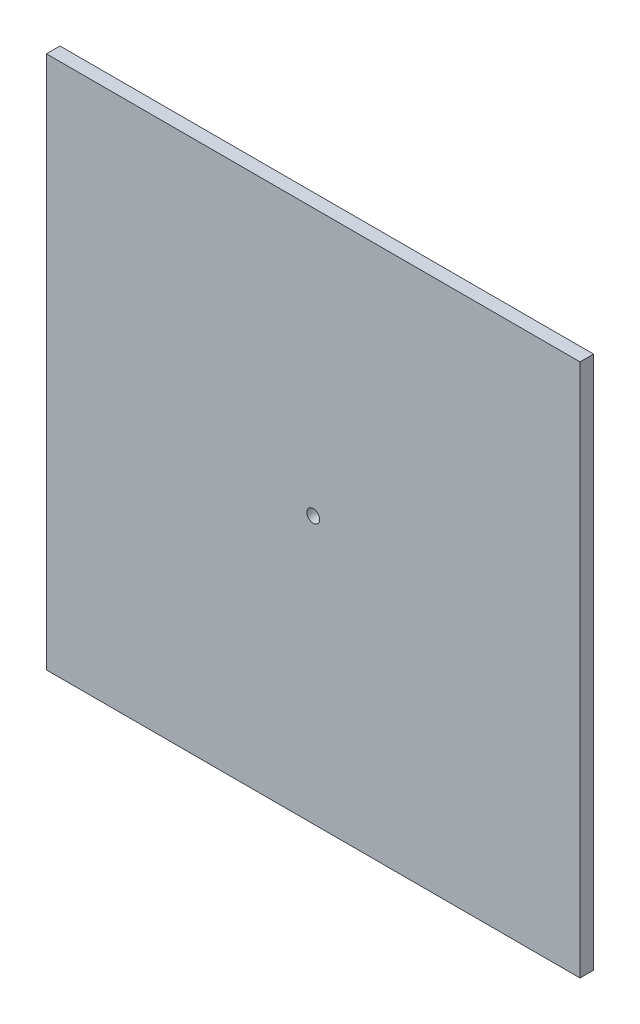
ISO-10303-21;
HEADER;
FILE_DESCRIPTION(('STEP AP214'),'2;1');
FILE_NAME('part.step','',(''),(''),'','','');
FILE_SCHEMA(('AUTOMOTIVE_DESIGN { 1 0 10303 214 1 1 1 1 }'));
ENDSEC;
DATA;
#1=APPLICATION_CONTEXT('core data for automotive mechanical design processes');
#2=APPLICATION_PROTOCOL_DEFINITION('international standard','automotive_design',2000,#1);
#3=PRODUCT_CONTEXT('',#1,'mechanical');
#4=PRODUCT('Part','Part','',(#3));
#5=PRODUCT_RELATED_PRODUCT_CATEGORY('part','',(#4));
#6=PRODUCT_DEFINITION_FORMATION('','',#4);
#7=PRODUCT_DEFINITION_CONTEXT('part definition',#1,'design');
#8=PRODUCT_DEFINITION('design','',#6,#7);
#9=PRODUCT_DEFINITION_SHAPE('','',#8);
#10=(LENGTH_UNIT() NAMED_UNIT(*) SI_UNIT(.MILLI.,.METRE.));
#11=(NAMED_UNIT(*) PLANE_ANGLE_UNIT() SI_UNIT($,.RADIAN.));
#12=(NAMED_UNIT(*) SI_UNIT($,.STERADIAN.) SOLID_ANGLE_UNIT());
#13=UNCERTAINTY_MEASURE_WITH_UNIT(LENGTH_MEASURE(1.E-05),#10,'distance_accuracy_value','');
#14=(GEOMETRIC_REPRESENTATION_CONTEXT(3) GLOBAL_UNCERTAINTY_ASSIGNED_CONTEXT((#13)) GLOBAL_UNIT_ASSIGNED_CONTEXT((#10,
#11,#12)) REPRESENTATION_CONTEXT('',''));
#15=CARTESIAN_POINT('',(0.,0.,0.));
#16=DIRECTION('',(0.,0.,1.));
#17=DIRECTION('',(1.,0.,0.));
#18=AXIS2_PLACEMENT_3D('',#15,#16,#17);
#19=CARTESIAN_POINT('',(-250.,-250.,12.7));
#20=DIRECTION('',(1.,0.,0.));
#21=DIRECTION('',(0.,0.,-1.));
#22=AXIS2_PLACEMENT_3D('',#19,#20,#21);
#23=PLANE('',#22);
#24=DIRECTION('',(0.,-1.,0.));
#25=VECTOR('',#24,1.);
#26=CARTESIAN_POINT('',(-250.,-250.,0.));
#27=LINE('',#26,#25);
#28=CARTESIAN_POINT('',(-250.,250.,0.));
#29=VERTEX_POINT('',#28);
#30=CARTESIAN_POINT('',(-250.,-250.,0.));
#31=VERTEX_POINT('',#30);
#32=EDGE_CURVE('E96',#29,#31,#27,.T.);
#33=ORIENTED_EDGE('',*,*,#32,.T.);
#34=DIRECTION('',(0.,0.,-1.));
#35=VECTOR('',#34,1.);
#36=CARTESIAN_POINT('',(-250.,-250.,12.7));
#37=LINE('',#36,#35);
#38=CARTESIAN_POINT('',(-250.,-250.,12.7));
#39=VERTEX_POINT('',#38);
#40=EDGE_CURVE('E11',#39,#31,#37,.T.);
#41=ORIENTED_EDGE('',*,*,#40,.F.);
#42=DIRECTION('',(0.,-1.,0.));
#43=VECTOR('',#42,1.);
#44=CARTESIAN_POINT('',(-250.,-250.,12.7));
#45=LINE('',#44,#43);
#46=CARTESIAN_POINT('',(-250.,250.,12.7));
#47=VERTEX_POINT('',#46);
#48=EDGE_CURVE('E84',#47,#39,#45,.T.);
#49=ORIENTED_EDGE('',*,*,#48,.F.);
#50=DIRECTION('',(0.,0.,-1.));
#51=VECTOR('',#50,1.);
#52=CARTESIAN_POINT('',(-250.,250.,12.7));
#53=LINE('',#52,#51);
#54=EDGE_CURVE('E92',#47,#29,#53,.T.);
#55=ORIENTED_EDGE('',*,*,#54,.T.);
#56=EDGE_LOOP('',(#33,#41,#49,#55));
#57=FACE_BOUND('',#56,.T.);
#58=ADVANCED_FACE('F33',(#57),#23,.F.);
#59=CARTESIAN_POINT('',(250.,-250.,12.7));
#60=DIRECTION('',(0.,1.,0.));
#61=DIRECTION('',(-1.,0.,0.));
#62=AXIS2_PLACEMENT_3D('',#59,#60,#61);
#63=PLANE('',#62);
#64=DIRECTION('',(1.,0.,0.));
#65=VECTOR('',#64,1.);
#66=CARTESIAN_POINT('',(250.,-250.,0.));
#67=LINE('',#66,#65);
#68=CARTESIAN_POINT('',(250.,-250.,0.));
#69=VERTEX_POINT('',#68);
#70=EDGE_CURVE('E88',#31,#69,#67,.T.);
#71=ORIENTED_EDGE('',*,*,#70,.T.);
#72=DIRECTION('',(0.,0.,-1.));
#73=VECTOR('',#72,1.);
#74=CARTESIAN_POINT('',(250.,-250.,12.7));
#75=LINE('',#74,#73);
#76=CARTESIAN_POINT('',(250.,-250.,12.7));
#77=VERTEX_POINT('',#76);
#78=EDGE_CURVE('E41',#77,#69,#75,.T.);
#79=ORIENTED_EDGE('',*,*,#78,.F.);
#80=DIRECTION('',(1.,0.,0.));
#81=VECTOR('',#80,1.);
#82=CARTESIAN_POINT('',(250.,-250.,12.7));
#83=LINE('',#82,#81);
#84=EDGE_CURVE('E79',#39,#77,#83,.T.);
#85=ORIENTED_EDGE('',*,*,#84,.F.);
#86=ORIENTED_EDGE('',*,*,#40,.T.);
#87=EDGE_LOOP('',(#71,#79,#85,#86));
#88=FACE_BOUND('',#87,.T.);
#89=ADVANCED_FACE('F87',(#88),#63,.F.);
#90=CARTESIAN_POINT('',(250.,-250.,12.7));
#91=DIRECTION('',(-1.,0.,0.));
#92=DIRECTION('',(0.,0.,1.));
#93=AXIS2_PLACEMENT_3D('',#90,#91,#92);
#94=PLANE('',#93);
#95=DIRECTION('',(0.,1.,0.));
#96=VECTOR('',#95,1.);
#97=CARTESIAN_POINT('',(250.,-250.,0.));
#98=LINE('',#97,#96);
#99=CARTESIAN_POINT('',(250.,250.,0.));
#100=VERTEX_POINT('',#99);
#101=EDGE_CURVE('E66',#69,#100,#98,.T.);
#102=ORIENTED_EDGE('',*,*,#101,.T.);
#103=DIRECTION('',(0.,0.,-1.));
#104=VECTOR('',#103,1.);
#105=CARTESIAN_POINT('',(250.,250.,12.7));
#106=LINE('',#105,#104);
#107=CARTESIAN_POINT('',(250.,250.,12.7));
#108=VERTEX_POINT('',#107);
#109=EDGE_CURVE('E89',#108,#100,#106,.T.);
#110=ORIENTED_EDGE('',*,*,#109,.F.);
#111=DIRECTION('',(0.,1.,0.));
#112=VECTOR('',#111,1.);
#113=CARTESIAN_POINT('',(250.,-250.,12.7));
#114=LINE('',#113,#112);
#115=EDGE_CURVE('E82',#77,#108,#114,.T.);
#116=ORIENTED_EDGE('',*,*,#115,.F.);
#117=ORIENTED_EDGE('',*,*,#78,.T.);
#118=EDGE_LOOP('',(#102,#110,#116,#117));
#119=FACE_BOUND('',#118,.T.);
#120=ADVANCED_FACE('F90',(#119),#94,.F.);
#121=CARTESIAN_POINT('',(250.,250.,12.7));
#122=DIRECTION('',(0.,-1.,0.));
#123=DIRECTION('',(1.,0.,0.));
#124=AXIS2_PLACEMENT_3D('',#121,#122,#123);
#125=PLANE('',#124);
#126=DIRECTION('',(-1.,0.,0.));
#127=VECTOR('',#126,1.);
#128=CARTESIAN_POINT('',(250.,250.,0.));
#129=LINE('',#128,#127);
#130=EDGE_CURVE('E72',#100,#29,#129,.T.);
#131=ORIENTED_EDGE('',*,*,#130,.T.);
#132=ORIENTED_EDGE('',*,*,#54,.F.);
#133=DIRECTION('',(-1.,0.,0.));
#134=VECTOR('',#133,1.);
#135=CARTESIAN_POINT('',(250.,250.,12.7));
#136=LINE('',#135,#134);
#137=EDGE_CURVE('E49',#108,#47,#136,.T.);
#138=ORIENTED_EDGE('',*,*,#137,.F.);
#139=ORIENTED_EDGE('',*,*,#109,.T.);
#140=EDGE_LOOP('',(#131,#132,#138,#139));
#141=FACE_BOUND('',#140,.T.);
#142=ADVANCED_FACE('F104',(#141),#125,.F.);
#143=CARTESIAN_POINT('',(0.,0.,12.7));
#144=DIRECTION('',(0.,0.,1.));
#145=DIRECTION('',(1.,0.,0.));
#146=AXIS2_PLACEMENT_3D('',#143,#144,#145);
#147=PLANE('',#146);
#148=CARTESIAN_POINT('',(0.,0.,12.7));
#149=DIRECTION('',(0.,0.,1.));
#150=DIRECTION('',(1.,0.,0.));
#151=AXIS2_PLACEMENT_3D('',#148,#149,#150);
#152=CIRCLE('',#151,6.);
#153=CARTESIAN_POINT('',(6.,0.,12.7));
#154=VERTEX_POINT('',#153);
#155=EDGE_CURVE('E112',#154,#154,#152,.T.);
#156=ORIENTED_EDGE('',*,*,#155,.F.);
#157=EDGE_LOOP('',(#156));
#158=FACE_BOUND('',#157,.T.);
#159=ORIENTED_EDGE('',*,*,#48,.T.);
#160=ORIENTED_EDGE('',*,*,#84,.T.);
#161=ORIENTED_EDGE('',*,*,#115,.T.);
#162=ORIENTED_EDGE('',*,*,#137,.T.);
#163=EDGE_LOOP('',(#159,#160,#161,#162));
#164=FACE_BOUND('',#163,.T.);
#165=ADVANCED_FACE('F80',(#158,#164),#147,.T.);
#166=CARTESIAN_POINT('',(0.,0.,0.));
#167=DIRECTION('',(0.,0.,1.));
#168=DIRECTION('',(1.,0.,0.));
#169=AXIS2_PLACEMENT_3D('',#166,#167,#168);
#170=PLANE('',#169);
#171=CARTESIAN_POINT('',(0.,0.,0.));
#172=DIRECTION('',(0.,0.,1.));
#173=DIRECTION('',(1.,0.,0.));
#174=AXIS2_PLACEMENT_3D('',#171,#172,#173);
#175=CIRCLE('',#174,6.);
#176=CARTESIAN_POINT('',(6.,0.,0.));
#177=VERTEX_POINT('',#176);
#178=EDGE_CURVE('E99',#177,#177,#175,.F.);
#179=ORIENTED_EDGE('',*,*,#178,.F.);
#180=EDGE_LOOP('',(#179));
#181=FACE_BOUND('',#180,.T.);
#182=ORIENTED_EDGE('',*,*,#32,.F.);
#183=ORIENTED_EDGE('',*,*,#130,.F.);
#184=ORIENTED_EDGE('',*,*,#101,.F.);
#185=ORIENTED_EDGE('',*,*,#70,.F.);
#186=EDGE_LOOP('',(#182,#183,#184,#185));
#187=FACE_BOUND('',#186,.T.);
#188=ADVANCED_FACE('F107',(#181,#187),#170,.F.);
#189=CARTESIAN_POINT('',(0.,0.,-16.9705627484771));
#190=DIRECTION('',(0.,0.,1.));
#191=DIRECTION('',(1.,0.,0.));
#192=AXIS2_PLACEMENT_3D('',#189,#190,#191);
#193=CYLINDRICAL_SURFACE('',#192,6.);
#194=ORIENTED_EDGE('',*,*,#178,.T.);
#195=EDGE_LOOP('',(#194));
#196=FACE_BOUND('',#195,.T.);
#197=ORIENTED_EDGE('',*,*,#155,.T.);
#198=EDGE_LOOP('',(#197));
#199=FACE_BOUND('',#198,.T.);
#200=ADVANCED_FACE('F116',(#196,#199),#193,.F.);
#201=CLOSED_SHELL('',(#58,#89,#120,#142,#165,#188,#200));
#202=MANIFOLD_SOLID_BREP('B2',#201);
#203=ADVANCED_BREP_SHAPE_REPRESENTATION('',(#18,#202),#14);
#204=SHAPE_DEFINITION_REPRESENTATION(#9,#203);
ENDSEC;
END-ISO-10303-21;
